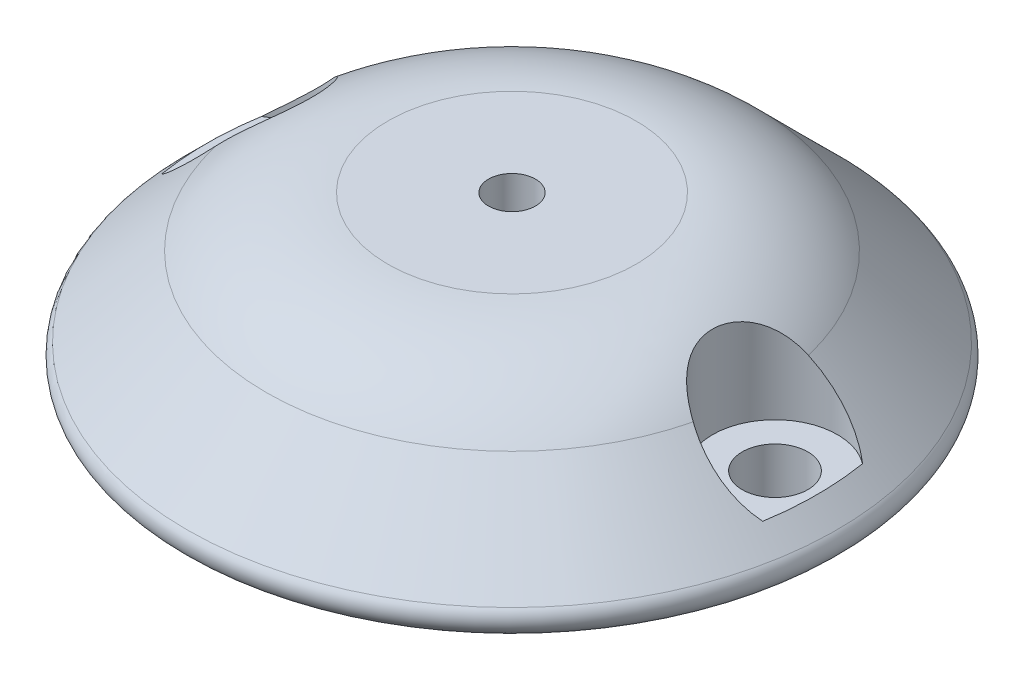
ISO-10303-21;
HEADER;
FILE_DESCRIPTION(('STEP AP214'),'2;1');
FILE_NAME('part.step','',(''),(''),'','','');
FILE_SCHEMA(('AUTOMOTIVE_DESIGN { 1 0 10303 214 1 1 1 1 }'));
ENDSEC;
DATA;
#1=APPLICATION_CONTEXT('core data for automotive mechanical design processes');
#2=APPLICATION_PROTOCOL_DEFINITION('international standard','automotive_design',2000,#1);
#3=PRODUCT_CONTEXT('',#1,'mechanical');
#4=PRODUCT('Part','Part','',(#3));
#5=PRODUCT_RELATED_PRODUCT_CATEGORY('part','',(#4));
#6=PRODUCT_DEFINITION_FORMATION('','',#4);
#7=PRODUCT_DEFINITION_CONTEXT('part definition',#1,'design');
#8=PRODUCT_DEFINITION('design','',#6,#7);
#9=PRODUCT_DEFINITION_SHAPE('','',#8);
#10=(LENGTH_UNIT() NAMED_UNIT(*) SI_UNIT(.MILLI.,.METRE.));
#11=(NAMED_UNIT(*) PLANE_ANGLE_UNIT() SI_UNIT($,.RADIAN.));
#12=(NAMED_UNIT(*) SI_UNIT($,.STERADIAN.) SOLID_ANGLE_UNIT());
#13=UNCERTAINTY_MEASURE_WITH_UNIT(LENGTH_MEASURE(1.E-05),#10,'distance_accuracy_value','');
#14=(GEOMETRIC_REPRESENTATION_CONTEXT(3) GLOBAL_UNCERTAINTY_ASSIGNED_CONTEXT((#13)) GLOBAL_UNIT_ASSIGNED_CONTEXT((#10,
#11,#12)) REPRESENTATION_CONTEXT('',''));
#15=CARTESIAN_POINT('',(0.,0.,0.));
#16=DIRECTION('',(0.,0.,1.));
#17=DIRECTION('',(1.,0.,0.));
#18=AXIS2_PLACEMENT_3D('',#15,#16,#17);
#19=CARTESIAN_POINT('',(0.,0.,0.));
#20=DIRECTION('',(0.,-1.,0.));
#21=DIRECTION('',(0.,0.,1.));
#22=AXIS2_PLACEMENT_3D('',#19,#20,#21);
#23=CONICAL_SURFACE('',#22,22.5,0.78539816339745);
#24=CARTESIAN_POINT('',(0.,6.77817459305204,0.));
#25=DIRECTION('',(0.,-1.,0.));
#26=DIRECTION('',(0.,0.,-1.));
#27=AXIS2_PLACEMENT_3D('',#24,#25,#26);
#28=CIRCLE('',#27,15.7218254069479);
#29=CARTESIAN_POINT('',(15.2829677399451,6.77817459305204,3.68872487268291));
#30=VERTEX_POINT('',#29);
#31=CARTESIAN_POINT('',(-15.2829677399452,6.77817459305204,3.68872487268292));
#32=VERTEX_POINT('',#31);
#33=EDGE_CURVE('E241',#30,#32,#28,.T.);
#34=ORIENTED_EDGE('',*,*,#33,.T.);
#35=CARTESIAN_POINT('',(-15.2827809101721,6.77837459305203,3.68864651167227));
#36=CARTESIAN_POINT('',(-15.3556214119869,6.70039792075547,3.71919565627907));
#37=CARTESIAN_POINT('',(-15.4291771882144,6.62223768590602,3.74751605339698));
#38=CARTESIAN_POINT('',(-15.5776040540579,6.46568132227529,3.79969735444955));
#39=CARTESIAN_POINT('',(-15.6524751115055,6.38728519930202,3.82355836728436));
#40=CARTESIAN_POINT('',(-15.878959549993,6.15186571266682,3.88847026467971));
#41=CARTESIAN_POINT('',(-16.0323805007537,5.99467943330654,3.92282337277419));
#42=CARTESIAN_POINT('',(-16.3443598610545,5.67955630530599,3.97358384555142));
#43=CARTESIAN_POINT('',(-16.5029531426249,5.52162642468076,3.98981835623395));
#44=CARTESIAN_POINT('',(-16.8226755978471,5.20760284012962,4.00319083112731));
#45=CARTESIAN_POINT('',(-16.9838038573479,5.05150850822159,4.00033552876619));
#46=CARTESIAN_POINT('',(-17.2753664604645,4.77275157035931,3.97725975147319));
#47=CARTESIAN_POINT('',(-17.4055839142719,4.64956965345093,3.96057686266032));
#48=CARTESIAN_POINT('',(-17.6659852752803,4.40571671747931,3.91390549758381));
#49=CARTESIAN_POINT('',(-17.7961691566899,4.28504655209695,3.88391257245397));
#50=CARTESIAN_POINT('',(-18.1839281874746,3.92911326056537,3.77342509493683));
#51=CARTESIAN_POINT('',(-18.4404140722418,3.69830320662007,3.67230383898596));
#52=CARTESIAN_POINT('',(-18.7832302471486,3.39498534938186,3.49228622050079));
#53=CARTESIAN_POINT('',(-18.8757395378771,3.31368016390115,3.43898486498313));
#54=CARTESIAN_POINT('',(-19.0582687378462,3.15423142854572,3.32362211758272));
#55=CARTESIAN_POINT('',(-19.1482847135834,3.0760927933348,3.26154773266341));
#56=CARTESIAN_POINT('',(-19.2366815222816,2.9998,3.19497794206911));
#57=B_SPLINE_CURVE_WITH_KNOTS('',3,(#35,#36,#37,#38,#39,#40,#41,#42,#43,#44,#45,#46,#47,#48,#49,
#50,#51,#52,#53,#54,#55,#56),.UNSPECIFIED.,.F.,.F.,(4,2,2,2,2,2,2,2,2,2,4),(0.,
0.332923737447555,0.665839343687091,1.33196078426048,2.00438419765175,2.67657044393553,
3.21612386085517,3.75585775895512,4.82832294364659,5.23065105942451,5.63358140008989),.UNSPECIFIED.);
#58=CARTESIAN_POINT('',(-19.236449792038,3.,3.19515248437382));
#59=VERTEX_POINT('',#58);
#60=EDGE_CURVE('E50',#32,#59,#57,.T.);
#61=ORIENTED_EDGE('',*,*,#60,.T.);
#62=CARTESIAN_POINT('',(0.,3.,0.));
#63=DIRECTION('',(0.,1.,0.));
#64=DIRECTION('',(0.,0.,1.));
#65=AXIS2_PLACEMENT_3D('',#62,#63,#64);
#66=CIRCLE('',#65,19.5);
#67=CARTESIAN_POINT('',(-19.236449792038,3.,-3.19515248437382));
#68=VERTEX_POINT('',#67);
#69=EDGE_CURVE('E11',#68,#59,#66,.T.);
#70=ORIENTED_EDGE('',*,*,#69,.F.);
#71=CARTESIAN_POINT('',(-19.2366815222816,2.9998,-3.19497794206911));
#72=CARTESIAN_POINT('',(-19.1244429595849,3.09666074565338,-3.27950092788761));
#73=CARTESIAN_POINT('',(-19.0095543267873,3.196547312217,-3.35680133139372));
#74=CARTESIAN_POINT('',(-18.7759968811746,3.40126905764813,-3.49738185689812));
#75=CARTESIAN_POINT('',(-18.6573335417717,3.50609716879653,-3.56068130758447));
#76=CARTESIAN_POINT('',(-18.4179246919157,3.71943017754951,-3.67368193603641));
#77=CARTESIAN_POINT('',(-18.2971898570869,3.82791802452729,-3.72343841781719));
#78=CARTESIAN_POINT('',(-18.0541668299962,4.04826573612872,-3.81025915963627));
#79=CARTESIAN_POINT('',(-17.9318779427408,4.1601271425323,-3.8473175177436));
#80=CARTESIAN_POINT('',(-17.6575494020541,4.41343509812977,-3.9165870188306));
#81=CARTESIAN_POINT('',(-17.505345613438,4.5555952662741,-3.94555360440932));
#82=CARTESIAN_POINT('',(-17.2014368007988,4.84293015571262,-3.98566613654094));
#83=CARTESIAN_POINT('',(-17.0497318774776,4.98810544699147,-3.99680868196262));
#84=CARTESIAN_POINT('',(-16.747782197924,5.28074070510491,-4.00200935221213));
#85=CARTESIAN_POINT('',(-16.5975402531299,5.42820403641085,-3.99603935222478));
#86=CARTESIAN_POINT('',(-16.2998618735929,5.72423310937551,-3.96753048107442));
#87=CARTESIAN_POINT('',(-16.1524243705452,5.87279840001984,-3.94499805423307));
#88=CARTESIAN_POINT('',(-15.8828775214537,6.14809583653357,-3.88831798647976));
#89=CARTESIAN_POINT('',(-15.7602593826737,6.27479266540987,-3.85639319579769));
#90=CARTESIAN_POINT('',(-15.5187421457102,6.5272759957753,-3.78107018755698));
#91=CARTESIAN_POINT('',(-15.399829817659,6.65306409776148,-3.73771973385811));
#92=CARTESIAN_POINT('',(-15.2827809101721,6.77837459305203,-3.68864651167227));
#93=B_SPLINE_CURVE_WITH_KNOTS('',3,(#71,#72,#73,#74,#75,#76,#77,#78,#79,#80,#81,#82,#83,#84,#85,
#86,#87,#88,#89,#90,#91,#92),.UNSPECIFIED.,.F.,.F.,(4,2,2,2,2,2,2,2,2,2,4),(0.,
0.511600261989383,1.02248977579381,1.53126060825215,2.04026759136353,2.67023220821521,
3.30031701873982,3.93143797988161,4.56231350627935,5.09946610559916,5.63440785886017),.UNSPECIFIED.);
#94=CARTESIAN_POINT('',(-15.2829677399451,6.77817459305204,-3.68872487268292));
#95=VERTEX_POINT('',#94);
#96=EDGE_CURVE('E194',#68,#95,#93,.T.);
#97=ORIENTED_EDGE('',*,*,#96,.T.);
#98=CARTESIAN_POINT('',(15.2829677399452,6.77817459305204,-3.68872487268292));
#99=VERTEX_POINT('',#98);
#100=EDGE_CURVE('E272',#95,#99,#28,.T.);
#101=ORIENTED_EDGE('',*,*,#100,.T.);
#102=CARTESIAN_POINT('',(15.2827809101721,6.77837459305203,-3.68864651167227));
#103=CARTESIAN_POINT('',(15.3556214119869,6.70039792075546,-3.71919565627907));
#104=CARTESIAN_POINT('',(15.4291771882144,6.62223768590601,-3.74751605339698));
#105=CARTESIAN_POINT('',(15.5776040540579,6.46568132227528,-3.79969735444956));
#106=CARTESIAN_POINT('',(15.6524751115055,6.38728519930201,-3.82355836728436));
#107=CARTESIAN_POINT('',(15.878959549993,6.15186571266682,-3.88847026467972));
#108=CARTESIAN_POINT('',(16.0323805007537,5.99467943330654,-3.9228233727742));
#109=CARTESIAN_POINT('',(16.3443598610545,5.67955630530599,-3.97358384555143));
#110=CARTESIAN_POINT('',(16.5029531426249,5.52162642468075,-3.98981835623396));
#111=CARTESIAN_POINT('',(16.8226755978471,5.20760284012961,-4.00319083112731));
#112=CARTESIAN_POINT('',(16.9838038573479,5.05150850822159,-4.00033552876619));
#113=CARTESIAN_POINT('',(17.2753664604645,4.7727515703593,-3.97725975147319));
#114=CARTESIAN_POINT('',(17.4055839142719,4.64956965345092,-3.96057686266032));
#115=CARTESIAN_POINT('',(17.6659852752803,4.4057167174793,-3.91390549758382));
#116=CARTESIAN_POINT('',(17.7961691566899,4.28504655209694,-3.88391257245397));
#117=CARTESIAN_POINT('',(18.1839281874746,3.92911326056536,-3.77342509493683));
#118=CARTESIAN_POINT('',(18.4404140722419,3.69830320662006,-3.67230383898596));
#119=CARTESIAN_POINT('',(18.7832302471486,3.39498534938186,-3.49228622050079));
#120=CARTESIAN_POINT('',(18.8757395378771,3.31368016390115,-3.43898486498313));
#121=CARTESIAN_POINT('',(19.0582687378463,3.15423142854572,-3.32362211758272));
#122=CARTESIAN_POINT('',(19.1482847135834,3.0760927933348,-3.26154773266341));
#123=CARTESIAN_POINT('',(19.2366815222816,2.9998,-3.19497794206912));
#124=B_SPLINE_CURVE_WITH_KNOTS('',3,(#102,#103,#104,#105,#106,#107,#108,#109,#110,#111,#112,
#113,#114,#115,#116,#117,#118,#119,#120,#121,#122,#123),.UNSPECIFIED.,.F.,.F.,(4,2,2,2,2,2,2,2,
2,2,4),(0.,0.332923737447557,0.665839343687096,1.33196078426049,2.00438419765176,
2.67657044393554,3.21612386085518,3.75585775895513,4.8283229436466,5.23065105942452,
5.63358140008988),.UNSPECIFIED.);
#125=CARTESIAN_POINT('',(19.236449792038,3.,-3.19515248437382));
#126=VERTEX_POINT('',#125);
#127=EDGE_CURVE('E58',#99,#126,#124,.T.);
#128=ORIENTED_EDGE('',*,*,#127,.T.);
#129=CARTESIAN_POINT('',(0.,3.,0.));
#130=DIRECTION('',(0.,1.,0.));
#131=DIRECTION('',(0.,0.,1.));
#132=AXIS2_PLACEMENT_3D('',#129,#130,#131);
#133=CIRCLE('',#132,19.5);
#134=CARTESIAN_POINT('',(19.236449792038,3.,3.19515248437381));
#135=VERTEX_POINT('',#134);
#136=EDGE_CURVE('E42',#135,#126,#133,.T.);
#137=ORIENTED_EDGE('',*,*,#136,.F.);
#138=CARTESIAN_POINT('',(19.2366815222816,2.9998,3.1949779420691));
#139=CARTESIAN_POINT('',(19.1244429595849,3.09666074565338,3.2795009278876));
#140=CARTESIAN_POINT('',(19.0095543267873,3.19654731221701,3.35680133139371));
#141=CARTESIAN_POINT('',(18.7759968811746,3.40126905764813,3.49738185689811));
#142=CARTESIAN_POINT('',(18.6573335417717,3.50609716879653,3.56068130758446));
#143=CARTESIAN_POINT('',(18.4179246919157,3.71943017754951,3.67368193603641));
#144=CARTESIAN_POINT('',(18.2971898570869,3.82791802452729,3.72343841781718));
#145=CARTESIAN_POINT('',(18.0541668299962,4.04826573612872,3.81025915963626));
#146=CARTESIAN_POINT('',(17.9318779427408,4.1601271425323,3.84731751774359));
#147=CARTESIAN_POINT('',(17.6575494020541,4.41343509812977,3.91658701883059));
#148=CARTESIAN_POINT('',(17.505345613438,4.5555952662741,3.94555360440931));
#149=CARTESIAN_POINT('',(17.2014368007988,4.84293015571263,3.98566613654093));
#150=CARTESIAN_POINT('',(17.0497318774776,4.98810544699147,3.99680868196261));
#151=CARTESIAN_POINT('',(16.747782197924,5.28074070510491,4.00200935221212));
#152=CARTESIAN_POINT('',(16.5975402531299,5.42820403641085,3.99603935222477));
#153=CARTESIAN_POINT('',(16.2998618735929,5.72423310937552,3.96753048107442));
#154=CARTESIAN_POINT('',(16.1524243705452,5.87279840001984,3.94499805423306));
#155=CARTESIAN_POINT('',(15.8828775214537,6.14809583653358,3.88831798647976));
#156=CARTESIAN_POINT('',(15.7602593826737,6.27479266540987,3.85639319579769));
#157=CARTESIAN_POINT('',(15.5187421457102,6.5272759957753,3.78107018755698));
#158=CARTESIAN_POINT('',(15.399829817659,6.65306409776148,3.7377197338581));
#159=CARTESIAN_POINT('',(15.2827809101721,6.77837459305203,3.68864651167226));
#160=B_SPLINE_CURVE_WITH_KNOTS('',3,(#138,#139,#140,#141,#142,#143,#144,#145,#146,#147,#148,
#149,#150,#151,#152,#153,#154,#155,#156,#157,#158,#159),.UNSPECIFIED.,.F.,.F.,(4,2,2,2,2,2,2,2,
2,2,4),(0.,0.511600261989383,1.02248977579381,1.53126060825215,2.04026759136353,2.6702322082152,
3.30031701873982,3.93143797988161,4.56231350627936,5.09946610559917,5.63440785886017),.UNSPECIFIED.);
#161=EDGE_CURVE('E123',#135,#30,#160,.T.);
#162=ORIENTED_EDGE('',*,*,#161,.T.);
#163=EDGE_LOOP('',(#34,#61,#70,#97,#101,#128,#137,#162));
#164=FACE_BOUND('',#163,.T.);
#165=CARTESIAN_POINT('',(0.,1.70710678118655,0.));
#166=DIRECTION('',(0.,1.,0.));
#167=DIRECTION('',(0.,0.,1.));
#168=AXIS2_PLACEMENT_3D('',#165,#166,#167);
#169=CIRCLE('',#168,20.7928932188135);
#170=CARTESIAN_POINT('',(0.,1.70710678118655,20.7928932188135));
#171=VERTEX_POINT('',#170);
#172=EDGE_CURVE('E263',#171,#171,#169,.T.);
#173=ORIENTED_EDGE('',*,*,#172,.T.);
#174=EDGE_LOOP('',(#173));
#175=FACE_BOUND('',#174,.T.);
#176=ADVANCED_FACE('F33',(#164,#175),#23,.T.);
#177=CARTESIAN_POINT('',(0.,10.,0.));
#178=DIRECTION('',(0.,1.,0.));
#179=DIRECTION('',(0.,0.,1.));
#180=AXIS2_PLACEMENT_3D('',#177,#178,#179);
#181=PLANE('',#180);
#182=CARTESIAN_POINT('',(0.,10.,0.));
#183=DIRECTION('',(0.,1.,0.));
#184=DIRECTION('',(0.,0.,1.));
#185=AXIS2_PLACEMENT_3D('',#182,#183,#184);
#186=CIRCLE('',#185,1.5);
#187=CARTESIAN_POINT('',(0.,10.,1.5));
#188=VERTEX_POINT('',#187);
#189=EDGE_CURVE('E226',#188,#188,#186,.T.);
#190=ORIENTED_EDGE('',*,*,#189,.F.);
#191=EDGE_LOOP('',(#190));
#192=FACE_BOUND('',#191,.T.);
#193=CARTESIAN_POINT('',(0.,10.,0.));
#194=DIRECTION('',(0.,1.,0.));
#195=DIRECTION('',(0.,0.,1.));
#196=AXIS2_PLACEMENT_3D('',#193,#194,#195);
#197=CIRCLE('',#196,7.94365081389593);
#198=CARTESIAN_POINT('',(0.,10.,7.94365081389593));
#199=VERTEX_POINT('',#198);
#200=EDGE_CURVE('E269',#199,#199,#197,.T.);
#201=ORIENTED_EDGE('',*,*,#200,.T.);
#202=EDGE_LOOP('',(#201));
#203=FACE_BOUND('',#202,.T.);
#204=ADVANCED_FACE('F170',(#192,#203),#181,.T.);
#205=CARTESIAN_POINT('',(0.,0.,0.));
#206=DIRECTION('',(0.,1.,0.));
#207=DIRECTION('',(0.,0.,1.));
#208=AXIS2_PLACEMENT_3D('',#205,#206,#207);
#209=PLANE('',#208);
#210=CARTESIAN_POINT('',(-16.83,0.,0.));
#211=DIRECTION('',(0.,1.,0.));
#212=DIRECTION('',(0.,0.,1.));
#213=AXIS2_PLACEMENT_3D('',#210,#211,#212);
#214=CIRCLE('',#213,2.1);
#215=CARTESIAN_POINT('',(-16.83,0.,2.1));
#216=VERTEX_POINT('',#215);
#217=EDGE_CURVE('E152',#216,#216,#214,.T.);
#218=ORIENTED_EDGE('',*,*,#217,.T.);
#219=EDGE_LOOP('',(#218));
#220=FACE_BOUND('',#219,.T.);
#221=CARTESIAN_POINT('',(16.83,0.,0.));
#222=DIRECTION('',(0.,1.,0.));
#223=DIRECTION('',(0.,0.,1.));
#224=AXIS2_PLACEMENT_3D('',#221,#222,#223);
#225=CIRCLE('',#224,2.1);
#226=CARTESIAN_POINT('',(16.83,0.,2.09999999999999));
#227=VERTEX_POINT('',#226);
#228=EDGE_CURVE('E230',#227,#227,#225,.T.);
#229=ORIENTED_EDGE('',*,*,#228,.T.);
#230=EDGE_LOOP('',(#229));
#231=FACE_BOUND('',#230,.T.);
#232=CARTESIAN_POINT('',(0.,0.,0.));
#233=DIRECTION('',(0.,1.,0.));
#234=DIRECTION('',(0.,0.,1.));
#235=AXIS2_PLACEMENT_3D('',#232,#233,#234);
#236=CIRCLE('',#235,20.0857864376269);
#237=CARTESIAN_POINT('',(0.,0.,20.0857864376269));
#238=VERTEX_POINT('',#237);
#239=EDGE_CURVE('E266',#238,#238,#236,.F.);
#240=ORIENTED_EDGE('',*,*,#239,.T.);
#241=EDGE_LOOP('',(#240));
#242=FACE_BOUND('',#241,.T.);
#243=DIRECTION('',(-1.,0.,0.));
#244=VECTOR('',#243,1.);
#245=CARTESIAN_POINT('',(-10.,0.,14.));
#246=LINE('',#245,#244);
#247=CARTESIAN_POINT('',(8.,0.,14.));
#248=VERTEX_POINT('',#247);
#249=CARTESIAN_POINT('',(-8.,0.,14.));
#250=VERTEX_POINT('',#249);
#251=EDGE_CURVE('E244',#248,#250,#246,.T.);
#252=ORIENTED_EDGE('',*,*,#251,.F.);
#253=CARTESIAN_POINT('',(8.,0.,12.));
#254=DIRECTION('',(0.,1.,0.));
#255=DIRECTION('',(0.,0.,1.));
#256=AXIS2_PLACEMENT_3D('',#253,#254,#255);
#257=CIRCLE('',#256,2.);
#258=CARTESIAN_POINT('',(10.,0.,12.));
#259=VERTEX_POINT('',#258);
#260=EDGE_CURVE('E305',#248,#259,#257,.T.);
#261=ORIENTED_EDGE('',*,*,#260,.T.);
#262=DIRECTION('',(0.,0.,1.));
#263=VECTOR('',#262,1.);
#264=CARTESIAN_POINT('',(10.,0.,-14.));
#265=LINE('',#264,#263);
#266=CARTESIAN_POINT('',(10.,0.,-12.));
#267=VERTEX_POINT('',#266);
#268=EDGE_CURVE('E242',#267,#259,#265,.T.);
#269=ORIENTED_EDGE('',*,*,#268,.F.);
#270=CARTESIAN_POINT('',(8.00000000000001,0.,-12.));
#271=DIRECTION('',(0.,1.,0.));
#272=DIRECTION('',(0.,0.,1.));
#273=AXIS2_PLACEMENT_3D('',#270,#271,#272);
#274=CIRCLE('',#273,2.);
#275=CARTESIAN_POINT('',(8.00000000000001,0.,-14.));
#276=VERTEX_POINT('',#275);
#277=EDGE_CURVE('E303',#267,#276,#274,.T.);
#278=ORIENTED_EDGE('',*,*,#277,.T.);
#279=DIRECTION('',(1.,0.,0.));
#280=VECTOR('',#279,1.);
#281=CARTESIAN_POINT('',(-9.99999999999999,0.,-14.));
#282=LINE('',#281,#280);
#283=CARTESIAN_POINT('',(-7.99999999999999,0.,-14.));
#284=VERTEX_POINT('',#283);
#285=EDGE_CURVE('E259',#284,#276,#282,.T.);
#286=ORIENTED_EDGE('',*,*,#285,.F.);
#287=CARTESIAN_POINT('',(-7.99999999999999,0.,-12.));
#288=DIRECTION('',(0.,1.,0.));
#289=DIRECTION('',(0.,0.,1.));
#290=AXIS2_PLACEMENT_3D('',#287,#288,#289);
#291=CIRCLE('',#290,2.);
#292=CARTESIAN_POINT('',(-9.99999999999999,0.,-12.));
#293=VERTEX_POINT('',#292);
#294=EDGE_CURVE('E307',#284,#293,#291,.T.);
#295=ORIENTED_EDGE('',*,*,#294,.T.);
#296=DIRECTION('',(0.,0.,-1.));
#297=VECTOR('',#296,1.);
#298=CARTESIAN_POINT('',(-9.99999999999999,0.,-14.));
#299=LINE('',#298,#297);
#300=CARTESIAN_POINT('',(-10.,0.,12.));
#301=VERTEX_POINT('',#300);
#302=EDGE_CURVE('E251',#301,#293,#299,.T.);
#303=ORIENTED_EDGE('',*,*,#302,.F.);
#304=CARTESIAN_POINT('',(-8.,0.,12.));
#305=DIRECTION('',(0.,1.,0.));
#306=DIRECTION('',(0.,0.,1.));
#307=AXIS2_PLACEMENT_3D('',#304,#305,#306);
#308=CIRCLE('',#307,2.);
#309=EDGE_CURVE('E301',#301,#250,#308,.T.);
#310=ORIENTED_EDGE('',*,*,#309,.T.);
#311=EDGE_LOOP('',(#252,#261,#269,#278,#286,#295,#303,#310));
#312=FACE_BOUND('',#311,.T.);
#313=ADVANCED_FACE('F175',(#220,#231,#242,#312),#209,.F.);
#314=CARTESIAN_POINT('',(0.,5.8,0.));
#315=DIRECTION('',(0.,1.,0.));
#316=DIRECTION('',(0.,0.,1.));
#317=AXIS2_PLACEMENT_3D('',#314,#315,#316);
#318=PLANE('',#317);
#319=CARTESIAN_POINT('',(0.,5.8,0.));
#320=DIRECTION('',(0.,1.,0.));
#321=DIRECTION('',(0.,0.,1.));
#322=AXIS2_PLACEMENT_3D('',#319,#320,#321);
#323=CIRCLE('',#322,1.5);
#324=CARTESIAN_POINT('',(0.,5.8,1.5));
#325=VERTEX_POINT('',#324);
#326=EDGE_CURVE('E37',#325,#325,#323,.T.);
#327=ORIENTED_EDGE('',*,*,#326,.T.);
#328=EDGE_LOOP('',(#327));
#329=FACE_BOUND('',#328,.T.);
#330=DIRECTION('',(-1.,0.,0.));
#331=VECTOR('',#330,1.);
#332=CARTESIAN_POINT('',(-10.,5.8,14.));
#333=LINE('',#332,#331);
#334=CARTESIAN_POINT('',(8.,5.8,14.));
#335=VERTEX_POINT('',#334);
#336=CARTESIAN_POINT('',(-8.,5.8,14.));
#337=VERTEX_POINT('',#336);
#338=EDGE_CURVE('E342',#335,#337,#333,.T.);
#339=ORIENTED_EDGE('',*,*,#338,.T.);
#340=CARTESIAN_POINT('',(-8.,5.8,12.));
#341=DIRECTION('',(0.,1.,0.));
#342=DIRECTION('',(0.,0.,1.));
#343=AXIS2_PLACEMENT_3D('',#340,#341,#342);
#344=CIRCLE('',#343,2.);
#345=CARTESIAN_POINT('',(-10.,5.8,12.));
#346=VERTEX_POINT('',#345);
#347=EDGE_CURVE('E290',#337,#346,#344,.F.);
#348=ORIENTED_EDGE('',*,*,#347,.T.);
#349=DIRECTION('',(0.,0.,-1.));
#350=VECTOR('',#349,1.);
#351=CARTESIAN_POINT('',(-9.99999999999999,5.8,-14.));
#352=LINE('',#351,#350);
#353=CARTESIAN_POINT('',(-9.99999999999999,5.8,-12.));
#354=VERTEX_POINT('',#353);
#355=EDGE_CURVE('E359',#346,#354,#352,.T.);
#356=ORIENTED_EDGE('',*,*,#355,.T.);
#357=CARTESIAN_POINT('',(-7.99999999999999,5.8,-12.));
#358=DIRECTION('',(0.,1.,0.));
#359=DIRECTION('',(0.,0.,1.));
#360=AXIS2_PLACEMENT_3D('',#357,#358,#359);
#361=CIRCLE('',#360,2.);
#362=CARTESIAN_POINT('',(-7.99999999999999,5.8,-14.));
#363=VERTEX_POINT('',#362);
#364=EDGE_CURVE('E284',#354,#363,#361,.F.);
#365=ORIENTED_EDGE('',*,*,#364,.T.);
#366=DIRECTION('',(1.,0.,0.));
#367=VECTOR('',#366,1.);
#368=CARTESIAN_POINT('',(-9.99999999999999,5.8,-14.));
#369=LINE('',#368,#367);
#370=CARTESIAN_POINT('',(8.00000000000001,5.8,-14.));
#371=VERTEX_POINT('',#370);
#372=EDGE_CURVE('E254',#363,#371,#369,.T.);
#373=ORIENTED_EDGE('',*,*,#372,.T.);
#374=CARTESIAN_POINT('',(8.00000000000001,5.8,-12.));
#375=DIRECTION('',(0.,1.,0.));
#376=DIRECTION('',(0.,0.,1.));
#377=AXIS2_PLACEMENT_3D('',#374,#375,#376);
#378=CIRCLE('',#377,2.);
#379=CARTESIAN_POINT('',(10.,5.8,-12.));
#380=VERTEX_POINT('',#379);
#381=EDGE_CURVE('E288',#371,#380,#378,.F.);
#382=ORIENTED_EDGE('',*,*,#381,.T.);
#383=DIRECTION('',(0.,0.,1.));
#384=VECTOR('',#383,1.);
#385=CARTESIAN_POINT('',(10.,5.8,-14.));
#386=LINE('',#385,#384);
#387=CARTESIAN_POINT('',(10.,5.8,12.));
#388=VERTEX_POINT('',#387);
#389=EDGE_CURVE('E262',#380,#388,#386,.T.);
#390=ORIENTED_EDGE('',*,*,#389,.T.);
#391=CARTESIAN_POINT('',(8.,5.8,12.));
#392=DIRECTION('',(0.,1.,0.));
#393=DIRECTION('',(0.,0.,1.));
#394=AXIS2_PLACEMENT_3D('',#391,#392,#393);
#395=CIRCLE('',#394,2.);
#396=EDGE_CURVE('E286',#388,#335,#395,.F.);
#397=ORIENTED_EDGE('',*,*,#396,.T.);
#398=EDGE_LOOP('',(#339,#348,#356,#365,#373,#382,#390,#397));
#399=FACE_BOUND('',#398,.T.);
#400=ADVANCED_FACE('F316',(#329,#399),#318,.F.);
#401=CARTESIAN_POINT('',(10.,5.8,-14.));
#402=DIRECTION('',(1.,0.,0.));
#403=DIRECTION('',(0.,0.,-1.));
#404=AXIS2_PLACEMENT_3D('',#401,#402,#403);
#405=PLANE('',#404);
#406=ORIENTED_EDGE('',*,*,#389,.F.);
#407=DIRECTION('',(0.,-1.,0.));
#408=VECTOR('',#407,1.);
#409=CARTESIAN_POINT('',(10.,0.,-12.));
#410=LINE('',#409,#408);
#411=EDGE_CURVE('E294',#380,#267,#410,.T.);
#412=ORIENTED_EDGE('',*,*,#411,.T.);
#413=ORIENTED_EDGE('',*,*,#268,.T.);
#414=DIRECTION('',(0.,-1.,0.));
#415=VECTOR('',#414,1.);
#416=CARTESIAN_POINT('',(10.,5.29534946591473,12.));
#417=LINE('',#416,#415);
#418=EDGE_CURVE('E292',#259,#388,#417,.F.);
#419=ORIENTED_EDGE('',*,*,#418,.T.);
#420=EDGE_LOOP('',(#406,#412,#413,#419));
#421=FACE_BOUND('',#420,.T.);
#422=ADVANCED_FACE('F321',(#421),#405,.F.);
#423=CARTESIAN_POINT('',(-9.99999999999999,5.8,-14.));
#424=DIRECTION('',(0.,0.,-1.));
#425=DIRECTION('',(-1.,0.,0.));
#426=AXIS2_PLACEMENT_3D('',#423,#424,#425);
#427=PLANE('',#426);
#428=ORIENTED_EDGE('',*,*,#285,.T.);
#429=DIRECTION('',(0.,-1.,0.));
#430=VECTOR('',#429,1.);
#431=CARTESIAN_POINT('',(8.00000000000001,5.29534946591473,-14.));
#432=LINE('',#431,#430);
#433=EDGE_CURVE('E299',#276,#371,#432,.F.);
#434=ORIENTED_EDGE('',*,*,#433,.T.);
#435=ORIENTED_EDGE('',*,*,#372,.F.);
#436=DIRECTION('',(0.,-1.,0.));
#437=VECTOR('',#436,1.);
#438=CARTESIAN_POINT('',(-7.99999999999999,0.,-14.));
#439=LINE('',#438,#437);
#440=EDGE_CURVE('E296',#363,#284,#439,.T.);
#441=ORIENTED_EDGE('',*,*,#440,.T.);
#442=EDGE_LOOP('',(#428,#434,#435,#441));
#443=FACE_BOUND('',#442,.T.);
#444=ADVANCED_FACE('F322',(#443),#427,.F.);
#445=CARTESIAN_POINT('',(-9.99999999999999,5.8,-14.));
#446=DIRECTION('',(-1.,0.,0.));
#447=DIRECTION('',(0.,0.,1.));
#448=AXIS2_PLACEMENT_3D('',#445,#446,#447);
#449=PLANE('',#448);
#450=ORIENTED_EDGE('',*,*,#355,.F.);
#451=DIRECTION('',(0.,-1.,0.));
#452=VECTOR('',#451,1.);
#453=CARTESIAN_POINT('',(-10.,0.,12.));
#454=LINE('',#453,#452);
#455=EDGE_CURVE('E276',#346,#301,#454,.T.);
#456=ORIENTED_EDGE('',*,*,#455,.T.);
#457=ORIENTED_EDGE('',*,*,#302,.T.);
#458=DIRECTION('',(0.,-1.,0.));
#459=VECTOR('',#458,1.);
#460=CARTESIAN_POINT('',(-9.99999999999999,5.29534946591473,-12.));
#461=LINE('',#460,#459);
#462=EDGE_CURVE('E274',#293,#354,#461,.F.);
#463=ORIENTED_EDGE('',*,*,#462,.T.);
#464=EDGE_LOOP('',(#450,#456,#457,#463));
#465=FACE_BOUND('',#464,.T.);
#466=ADVANCED_FACE('F325',(#465),#449,.F.);
#467=CARTESIAN_POINT('',(-10.,5.8,14.));
#468=DIRECTION('',(0.,0.,1.));
#469=DIRECTION('',(1.,0.,0.));
#470=AXIS2_PLACEMENT_3D('',#467,#468,#469);
#471=PLANE('',#470);
#472=ORIENTED_EDGE('',*,*,#251,.T.);
#473=DIRECTION('',(0.,-1.,0.));
#474=VECTOR('',#473,1.);
#475=CARTESIAN_POINT('',(-8.,5.29534946591473,14.));
#476=LINE('',#475,#474);
#477=EDGE_CURVE('E282',#250,#337,#476,.F.);
#478=ORIENTED_EDGE('',*,*,#477,.T.);
#479=ORIENTED_EDGE('',*,*,#338,.F.);
#480=DIRECTION('',(0.,-1.,0.));
#481=VECTOR('',#480,1.);
#482=CARTESIAN_POINT('',(8.,0.,14.));
#483=LINE('',#482,#481);
#484=EDGE_CURVE('E279',#335,#248,#483,.T.);
#485=ORIENTED_EDGE('',*,*,#484,.T.);
#486=EDGE_LOOP('',(#472,#478,#479,#485));
#487=FACE_BOUND('',#486,.T.);
#488=ADVANCED_FACE('F329',(#487),#471,.F.);
#489=CARTESIAN_POINT('',(0.,1.,0.));
#490=DIRECTION('',(0.,1.,0.));
#491=DIRECTION('',(0.,0.,1.));
#492=AXIS2_PLACEMENT_3D('',#489,#490,#491);
#493=TOROIDAL_SURFACE('',#492,20.0857864376269,1.);
#494=ORIENTED_EDGE('',*,*,#239,.F.);
#495=EDGE_LOOP('',(#494));
#496=FACE_BOUND('',#495,.T.);
#497=ORIENTED_EDGE('',*,*,#172,.F.);
#498=EDGE_LOOP('',(#497));
#499=FACE_BOUND('',#498,.T.);
#500=ADVANCED_FACE('F181',(#496,#499),#493,.T.);
#501=CARTESIAN_POINT('',(0.,-0.999999999999997,0.));
#502=DIRECTION('',(0.,1.,0.));
#503=DIRECTION('',(0.,0.,1.));
#504=AXIS2_PLACEMENT_3D('',#501,#502,#503);
#505=DEGENERATE_TOROIDAL_SURFACE('',#504,7.94365081389593,11.,.T.);
#506=CARTESIAN_POINT('',(-15.283154567291,6.77797459305204,3.68880322154862));
#507=CARTESIAN_POINT('',(-15.1916388147093,6.87596686921446,3.65042309964722));
#508=CARTESIAN_POINT('',(-15.0995000319904,6.97179517170423,3.60778306841231));
#509=CARTESIAN_POINT('',(-14.9148089856312,7.15869590521139,3.51323773932636));
#510=CARTESIAN_POINT('',(-14.8222562850131,7.24975995693166,3.46131678257641));
#511=CARTESIAN_POINT('',(-14.6372525538536,7.42697558958405,3.34719805720307));
#512=CARTESIAN_POINT('',(-14.5448066296315,7.51308894623902,3.28493186189526));
#513=CARTESIAN_POINT('',(-14.3620512898898,7.67894778504341,3.14994500835223));
#514=CARTESIAN_POINT('',(-14.271740404873,7.75869774241401,3.07723179985272));
#515=CARTESIAN_POINT('',(-14.0439768474604,7.95480913882559,2.87617884798981));
#516=CARTESIAN_POINT('',(-13.9090196220924,8.06610475947076,2.7397683581481));
#517=CARTESIAN_POINT('',(-13.718426548748,8.21781379345679,2.51550305781718));
#518=CARTESIAN_POINT('',(-13.6569206475522,8.26580710899618,2.43755401917711));
#519=CARTESIAN_POINT('',(-13.5386337299187,8.35654104882459,2.27529467485413));
#520=CARTESIAN_POINT('',(-13.4818504356732,8.39928421016793,2.19098747369596));
#521=CARTESIAN_POINT('',(-13.3734661732994,8.47958869867628,2.01570774281569));
#522=CARTESIAN_POINT('',(-13.321908986707,8.51710709889961,1.92468843684088));
#523=CARTESIAN_POINT('',(-13.2253730128735,8.58636288191456,1.73717483909523));
#524=CARTESIAN_POINT('',(-13.1803912704693,8.61810286325072,1.64068303402853));
#525=CARTESIAN_POINT('',(-13.0977429406759,8.67571205441289,1.44283078675444));
#526=CARTESIAN_POINT('',(-13.0600821004161,8.70157665455049,1.34146659680951));
#527=CARTESIAN_POINT('',(-12.9928082685672,8.74732552860532,1.13479733550207));
#528=CARTESIAN_POINT('',(-12.9631943976591,8.76721045596658,1.02949269615739));
#529=CARTESIAN_POINT('',(-12.915289872003,8.79914719745187,0.827427348766008));
#530=CARTESIAN_POINT('',(-12.8961224687245,8.81181251674092,0.73097003302807));
#531=CARTESIAN_POINT('',(-12.8648999435531,8.8323578820227,0.536370911022936));
#532=CARTESIAN_POINT('',(-12.8528471538074,8.84023635892884,0.438228563244328));
#533=CARTESIAN_POINT('',(-12.8360514499433,8.8511969399145,0.24114065641311));
#534=CARTESIAN_POINT('',(-12.8313022452776,8.85428317155705,0.142195862437949));
#535=CARTESIAN_POINT('',(-12.8291638036051,8.85567414058439,-0.0558444547006774));
#536=CARTESIAN_POINT('',(-12.8317772393747,8.85397714156672,-0.154940019546149));
#537=CARTESIAN_POINT('',(-12.8440462166785,8.84598229713219,-0.347996165377534));
#538=CARTESIAN_POINT('',(-12.8533779999956,8.83989595257392,-0.441986330639322));
#539=CARTESIAN_POINT('',(-12.8785976313968,8.82335608265516,-0.628728202539675));
#540=CARTESIAN_POINT('',(-12.8944877735096,8.81290102916124,-0.721479464094592));
#541=CARTESIAN_POINT('',(-12.9326027764892,8.78763033799364,-0.905028927930863));
#542=CARTESIAN_POINT('',(-12.9548253214613,8.77281629443116,-0.995827831199019));
#543=CARTESIAN_POINT('',(-13.0053163537172,8.73883376557119,-1.17492820760143));
#544=CARTESIAN_POINT('',(-13.0335870787924,8.71966366839576,-1.26322874262497));
#545=CARTESIAN_POINT('',(-13.0960049272724,8.67685697510572,-1.43731856690729));
#546=CARTESIAN_POINT('',(-13.1301901573086,8.6531913110571,-1.52308706443099));
#547=CARTESIAN_POINT('',(-13.2038475152288,8.60153897504348,-1.69098760609868));
#548=CARTESIAN_POINT('',(-13.2433215444791,8.57355074852695,-1.77311832823743));
#549=CARTESIAN_POINT('',(-13.3688622544729,8.48326350438675,-2.01321689534262));
#550=CARTESIAN_POINT('',(-13.4621382193126,8.41458122594634,-2.165139114978));
#551=CARTESIAN_POINT('',(-13.669140369825,8.25691343898216,-2.45826967966108));
#552=CARTESIAN_POINT('',(-13.7837429136403,8.1669762245405,-2.5983336329691));
#553=CARTESIAN_POINT('',(-14.0241986738578,7.97092003113625,-2.85633524083679));
#554=CARTESIAN_POINT('',(-14.150078812349,7.86476187918782,-2.97421774738611));
#555=CARTESIAN_POINT('',(-14.3605824289483,7.68009832363201,-3.14852980146761));
#556=CARTESIAN_POINT('',(-14.4434205128607,7.60571508882338,-3.21164885891714));
#557=CARTESIAN_POINT('',(-14.610546990034,7.45185504563366,-3.32933460156351));
#558=CARTESIAN_POINT('',(-14.6948361322574,7.37237554541939,-3.38389671369796));
#559=CARTESIAN_POINT('',(-14.8634124866589,7.20932283780218,-3.48455549931275));
#560=CARTESIAN_POINT('',(-14.9476972197862,7.12577422585868,-3.53069656818586));
#561=CARTESIAN_POINT('',(-15.1158754801222,6.95473815712171,-3.61533105102244));
#562=CARTESIAN_POINT('',(-15.1997693684522,6.86725584287601,-3.65383411299003));
#563=CARTESIAN_POINT('',(-15.283154567291,6.77797459305204,-3.68880322154862));
#564=B_SPLINE_CURVE_WITH_KNOTS('',3,(#506,#507,#508,#509,#510,#511,#512,#513,#514,#515,#516,
#517,#518,#519,#520,#521,#522,#523,#524,#525,#526,#527,#528,#529,#530,#531,#532,#533,#534,#535,
#536,#537,#538,#539,#540,#541,#542,#543,#544,#545,#546,#547,#548,#549,#550,#551,#552,#553,#554,
#555,#556,#557,#558,#559,#560,#561,#562,#563),.UNSPECIFIED.,.F.,.F.,(4,2,2,2,2,2,2,2,2,2,2,2,2,
2,2,2,2,2,2,2,2,2,2,2,2,2,2,2,4),(0.,0.418402077555917,0.837516868865441,1.25952305419335,
1.68122978810333,2.34349252897621,2.67401426304347,3.00437564402244,3.33730865450364,
3.67009157377865,4.00313469193582,4.33614140271845,4.63323353980504,4.93042300872566,
5.22735636595835,5.52439752945107,5.80800771118756,6.09171718026273,6.37532302360823,
6.65903398149567,6.94464600072915,7.23036097670939,7.80098758188178,8.40495004076645,
9.01039479803519,9.39397423908874,9.77775798186912,10.1594559840204,10.5406687277331),.UNSPECIFIED.);
#565=EDGE_CURVE('E140',#32,#95,#564,.T.);
#566=ORIENTED_EDGE('',*,*,#565,.F.);
#567=ORIENTED_EDGE('',*,*,#33,.F.);
#568=CARTESIAN_POINT('',(15.283154567291,6.77797459305204,-3.68880322154862));
#569=CARTESIAN_POINT('',(15.1916388147093,6.87596686921446,-3.65042309964723));
#570=CARTESIAN_POINT('',(15.0995000319904,6.97179517170423,-3.60778306841231));
#571=CARTESIAN_POINT('',(14.9148089856312,7.15869590521139,-3.51323773932636));
#572=CARTESIAN_POINT('',(14.8222562850131,7.24975995693166,-3.46131678257641));
#573=CARTESIAN_POINT('',(14.6372525538536,7.42697558958405,-3.34719805720308));
#574=CARTESIAN_POINT('',(14.5448066296315,7.51308894623902,-3.28493186189527));
#575=CARTESIAN_POINT('',(14.3620512898898,7.67894778504341,-3.14994500835223));
#576=CARTESIAN_POINT('',(14.271740404873,7.75869774241401,-3.07723179985273));
#577=CARTESIAN_POINT('',(14.0439768474604,7.95480913882558,-2.87617884798982));
#578=CARTESIAN_POINT('',(13.9090196220924,8.06610475947075,-2.73976835814811));
#579=CARTESIAN_POINT('',(13.718426548748,8.21781379345678,-2.51550305781719));
#580=CARTESIAN_POINT('',(13.6569206475522,8.26580710899618,-2.43755401917712));
#581=CARTESIAN_POINT('',(13.5386337299187,8.35654104882459,-2.27529467485414));
#582=CARTESIAN_POINT('',(13.4818504356732,8.39928421016793,-2.19098747369597));
#583=CARTESIAN_POINT('',(13.3734661732994,8.47958869867627,-2.0157077428157));
#584=CARTESIAN_POINT('',(13.321908986707,8.51710709889961,-1.92468843684089));
#585=CARTESIAN_POINT('',(13.2253730128735,8.58636288191456,-1.73717483909524));
#586=CARTESIAN_POINT('',(13.1803912704693,8.61810286325072,-1.64068303402854));
#587=CARTESIAN_POINT('',(13.0977429406759,8.67571205441289,-1.44283078675445));
#588=CARTESIAN_POINT('',(13.0600821004161,8.70157665455049,-1.34146659680952));
#589=CARTESIAN_POINT('',(12.9928082685672,8.74732552860532,-1.13479733550208));
#590=CARTESIAN_POINT('',(12.9631943976591,8.76721045596658,-1.0294926961574));
#591=CARTESIAN_POINT('',(12.915289872003,8.79914719745187,-0.827427348766021));
#592=CARTESIAN_POINT('',(12.8961224687245,8.81181251674092,-0.730970033028083));
#593=CARTESIAN_POINT('',(12.8648999435531,8.8323578820227,-0.536370911022949));
#594=CARTESIAN_POINT('',(12.8528471538074,8.84023635892884,-0.438228563244341));
#595=CARTESIAN_POINT('',(12.8360514499433,8.85119693991449,-0.241140656413123));
#596=CARTESIAN_POINT('',(12.8313022452776,8.85428317155705,-0.142195862437962));
#597=CARTESIAN_POINT('',(12.8291638036051,8.85567414058439,0.0558444547006647));
#598=CARTESIAN_POINT('',(12.8317772393747,8.85397714156672,0.154940019546137));
#599=CARTESIAN_POINT('',(12.8440462166785,8.84598229713219,0.347996165377522));
#600=CARTESIAN_POINT('',(12.8533779999956,8.83989595257391,0.441986330639309));
#601=CARTESIAN_POINT('',(12.8785976313968,8.82335608265516,0.628728202539663));
#602=CARTESIAN_POINT('',(12.8944877735096,8.81290102916124,0.72147946409458));
#603=CARTESIAN_POINT('',(12.9326027764892,8.78763033799364,0.90502892793085));
#604=CARTESIAN_POINT('',(12.9548253214613,8.77281629443116,0.995827831199007));
#605=CARTESIAN_POINT('',(13.0053163537172,8.73883376557119,1.17492820760142));
#606=CARTESIAN_POINT('',(13.0335870787924,8.71966366839575,1.26322874262495));
#607=CARTESIAN_POINT('',(13.0960049272724,8.67685697510572,1.43731856690728));
#608=CARTESIAN_POINT('',(13.1301901573086,8.6531913110571,1.52308706443097));
#609=CARTESIAN_POINT('',(13.2038475152288,8.60153897504348,1.69098760609867));
#610=CARTESIAN_POINT('',(13.2433215444791,8.57355074852695,1.77311832823742));
#611=CARTESIAN_POINT('',(13.3688622544729,8.48326350438676,2.01321689534261));
#612=CARTESIAN_POINT('',(13.4621382193126,8.41458122594634,2.16513911497799));
#613=CARTESIAN_POINT('',(13.669140369825,8.25691343898216,2.45826967966107));
#614=CARTESIAN_POINT('',(13.7837429136403,8.1669762245405,2.59833363296909));
#615=CARTESIAN_POINT('',(14.0241986738578,7.97092003113625,2.85633524083678));
#616=CARTESIAN_POINT('',(14.150078812349,7.86476187918783,2.9742177473861));
#617=CARTESIAN_POINT('',(14.3605824289483,7.68009832363201,3.1485298014676));
#618=CARTESIAN_POINT('',(14.4434205128607,7.60571508882338,3.21164885891713));
#619=CARTESIAN_POINT('',(14.610546990034,7.45185504563366,3.32933460156351));
#620=CARTESIAN_POINT('',(14.6948361322574,7.3723755454194,3.38389671369795));
#621=CARTESIAN_POINT('',(14.8634124866589,7.20932283780219,3.48455549931274));
#622=CARTESIAN_POINT('',(14.9476972197862,7.12577422585868,3.53069656818585));
#623=CARTESIAN_POINT('',(15.1158754801222,6.95473815712172,3.61533105102243));
#624=CARTESIAN_POINT('',(15.1997693684522,6.86725584287601,3.65383411299002));
#625=CARTESIAN_POINT('',(15.283154567291,6.77797459305204,3.68880322154861));
#626=B_SPLINE_CURVE_WITH_KNOTS('',3,(#568,#569,#570,#571,#572,#573,#574,#575,#576,#577,#578,
#579,#580,#581,#582,#583,#584,#585,#586,#587,#588,#589,#590,#591,#592,#593,#594,#595,#596,#597,
#598,#599,#600,#601,#602,#603,#604,#605,#606,#607,#608,#609,#610,#611,#612,#613,#614,#615,#616,
#617,#618,#619,#620,#621,#622,#623,#624,#625),.UNSPECIFIED.,.F.,.F.,(4,2,2,2,2,2,2,2,2,2,2,2,2,
2,2,2,2,2,2,2,2,2,2,2,2,2,2,2,4),(0.,0.418402077555917,0.837516868865439,1.25952305419335,
1.68122978810333,2.3434925289762,2.67401426304346,3.00437564402243,3.33730865450363,
3.67009157377864,4.00313469193582,4.33614140271844,4.63323353980503,4.93042300872565,
5.22735636595834,5.52439752945106,5.80800771118755,6.09171718026272,6.37532302360822,
6.65903398149566,6.94464600072913,7.23036097670938,7.80098758188177,8.40495004076644,
9.01039479803518,9.39397423908874,9.77775798186912,10.1594559840203,10.5406687277331),.UNSPECIFIED.);
#627=EDGE_CURVE('E127',#99,#30,#626,.T.);
#628=ORIENTED_EDGE('',*,*,#627,.F.);
#629=ORIENTED_EDGE('',*,*,#100,.F.);
#630=EDGE_LOOP('',(#566,#567,#628,#629));
#631=FACE_BOUND('',#630,.T.);
#632=ORIENTED_EDGE('',*,*,#200,.F.);
#633=EDGE_LOOP('',(#632));
#634=FACE_BOUND('',#633,.T.);
#635=ADVANCED_FACE('F311',(#631,#634),#505,.T.);
#636=CARTESIAN_POINT('',(-8.,5.8,12.));
#637=DIRECTION('',(0.,1.,0.));
#638=DIRECTION('',(0.,0.,1.));
#639=AXIS2_PLACEMENT_3D('',#636,#637,#638);
#640=CYLINDRICAL_SURFACE('',#639,2.);
#641=ORIENTED_EDGE('',*,*,#347,.F.);
#642=ORIENTED_EDGE('',*,*,#477,.F.);
#643=ORIENTED_EDGE('',*,*,#309,.F.);
#644=ORIENTED_EDGE('',*,*,#455,.F.);
#645=EDGE_LOOP('',(#641,#642,#643,#644));
#646=FACE_BOUND('',#645,.T.);
#647=ADVANCED_FACE('F362',(#646),#640,.F.);
#648=CARTESIAN_POINT('',(8.00000000000001,5.8,-12.));
#649=DIRECTION('',(0.,1.,0.));
#650=DIRECTION('',(0.,0.,1.));
#651=AXIS2_PLACEMENT_3D('',#648,#649,#650);
#652=CYLINDRICAL_SURFACE('',#651,2.);
#653=ORIENTED_EDGE('',*,*,#381,.F.);
#654=ORIENTED_EDGE('',*,*,#433,.F.);
#655=ORIENTED_EDGE('',*,*,#277,.F.);
#656=ORIENTED_EDGE('',*,*,#411,.F.);
#657=EDGE_LOOP('',(#653,#654,#655,#656));
#658=FACE_BOUND('',#657,.T.);
#659=ADVANCED_FACE('F345',(#658),#652,.F.);
#660=CARTESIAN_POINT('',(8.,5.8,12.));
#661=DIRECTION('',(0.,1.,0.));
#662=DIRECTION('',(0.,0.,1.));
#663=AXIS2_PLACEMENT_3D('',#660,#661,#662);
#664=CYLINDRICAL_SURFACE('',#663,2.);
#665=ORIENTED_EDGE('',*,*,#396,.F.);
#666=ORIENTED_EDGE('',*,*,#418,.F.);
#667=ORIENTED_EDGE('',*,*,#260,.F.);
#668=ORIENTED_EDGE('',*,*,#484,.F.);
#669=EDGE_LOOP('',(#665,#666,#667,#668));
#670=FACE_BOUND('',#669,.T.);
#671=ADVANCED_FACE('F167',(#670),#664,.F.);
#672=CARTESIAN_POINT('',(-7.99999999999999,5.8,-12.));
#673=DIRECTION('',(0.,1.,0.));
#674=DIRECTION('',(0.,0.,1.));
#675=AXIS2_PLACEMENT_3D('',#672,#673,#674);
#676=CYLINDRICAL_SURFACE('',#675,2.);
#677=ORIENTED_EDGE('',*,*,#364,.F.);
#678=ORIENTED_EDGE('',*,*,#462,.F.);
#679=ORIENTED_EDGE('',*,*,#294,.F.);
#680=ORIENTED_EDGE('',*,*,#440,.F.);
#681=EDGE_LOOP('',(#677,#678,#679,#680));
#682=FACE_BOUND('',#681,.T.);
#683=ADVANCED_FACE('F35',(#682),#676,.F.);
#684=CARTESIAN_POINT('',(16.83,3.,0.));
#685=DIRECTION('',(0.,1.,0.));
#686=DIRECTION('',(0.,0.,1.));
#687=AXIS2_PLACEMENT_3D('',#684,#685,#686);
#688=PLANE('',#687);
#689=CARTESIAN_POINT('',(16.83,3.,0.));
#690=DIRECTION('',(0.,1.,0.));
#691=DIRECTION('',(0.,0.,1.));
#692=AXIS2_PLACEMENT_3D('',#689,#690,#691);
#693=CIRCLE('',#692,2.1);
#694=CARTESIAN_POINT('',(16.83,3.,2.09999999999999));
#695=VERTEX_POINT('',#694);
#696=EDGE_CURVE('E136',#695,#695,#693,.T.);
#697=ORIENTED_EDGE('',*,*,#696,.F.);
#698=EDGE_LOOP('',(#697));
#699=FACE_BOUND('',#698,.T.);
#700=ORIENTED_EDGE('',*,*,#136,.T.);
#701=CARTESIAN_POINT('',(16.83,3.,0.));
#702=DIRECTION('',(0.,1.,0.));
#703=DIRECTION('',(0.,0.,1.));
#704=AXIS2_PLACEMENT_3D('',#701,#702,#703);
#705=CIRCLE('',#704,4.);
#706=EDGE_CURVE('E126',#126,#135,#705,.T.);
#707=ORIENTED_EDGE('',*,*,#706,.T.);
#708=EDGE_LOOP('',(#700,#707));
#709=FACE_BOUND('',#708,.T.);
#710=ADVANCED_FACE('F135',(#699,#709),#688,.T.);
#711=CARTESIAN_POINT('',(16.83,3.,0.));
#712=DIRECTION('',(0.,1.,0.));
#713=DIRECTION('',(0.,0.,1.));
#714=AXIS2_PLACEMENT_3D('',#711,#712,#713);
#715=CYLINDRICAL_SURFACE('',#714,4.);
#716=ORIENTED_EDGE('',*,*,#627,.T.);
#717=ORIENTED_EDGE('',*,*,#161,.F.);
#718=ORIENTED_EDGE('',*,*,#706,.F.);
#719=ORIENTED_EDGE('',*,*,#127,.F.);
#720=EDGE_LOOP('',(#716,#717,#718,#719));
#721=FACE_BOUND('',#720,.T.);
#722=ADVANCED_FACE('F125',(#721),#715,.F.);
#723=CARTESIAN_POINT('',(-16.83,3.,0.));
#724=DIRECTION('',(0.,1.,0.));
#725=DIRECTION('',(0.,0.,1.));
#726=AXIS2_PLACEMENT_3D('',#723,#724,#725);
#727=PLANE('',#726);
#728=CARTESIAN_POINT('',(-16.83,3.,0.));
#729=DIRECTION('',(0.,1.,0.));
#730=DIRECTION('',(0.,0.,1.));
#731=AXIS2_PLACEMENT_3D('',#728,#729,#730);
#732=CIRCLE('',#731,2.1);
#733=CARTESIAN_POINT('',(-16.83,3.,2.1));
#734=VERTEX_POINT('',#733);
#735=EDGE_CURVE('E150',#734,#734,#732,.T.);
#736=ORIENTED_EDGE('',*,*,#735,.F.);
#737=EDGE_LOOP('',(#736));
#738=FACE_BOUND('',#737,.T.);
#739=ORIENTED_EDGE('',*,*,#69,.T.);
#740=CARTESIAN_POINT('',(-16.83,3.,0.));
#741=DIRECTION('',(0.,1.,0.));
#742=DIRECTION('',(0.,0.,1.));
#743=AXIS2_PLACEMENT_3D('',#740,#741,#742);
#744=CIRCLE('',#743,4.);
#745=EDGE_CURVE('E132',#59,#68,#744,.T.);
#746=ORIENTED_EDGE('',*,*,#745,.T.);
#747=EDGE_LOOP('',(#739,#746));
#748=FACE_BOUND('',#747,.T.);
#749=ADVANCED_FACE('F165',(#738,#748),#727,.T.);
#750=CARTESIAN_POINT('',(-16.83,3.,0.));
#751=DIRECTION('',(0.,1.,0.));
#752=DIRECTION('',(0.,0.,1.));
#753=AXIS2_PLACEMENT_3D('',#750,#751,#752);
#754=CYLINDRICAL_SURFACE('',#753,4.);
#755=ORIENTED_EDGE('',*,*,#565,.T.);
#756=ORIENTED_EDGE('',*,*,#96,.F.);
#757=ORIENTED_EDGE('',*,*,#745,.F.);
#758=ORIENTED_EDGE('',*,*,#60,.F.);
#759=EDGE_LOOP('',(#755,#756,#757,#758));
#760=FACE_BOUND('',#759,.T.);
#761=ADVANCED_FACE('F203',(#760),#754,.F.);
#762=CARTESIAN_POINT('',(-16.83,0.,0.));
#763=DIRECTION('',(0.,1.,0.));
#764=DIRECTION('',(0.,0.,1.));
#765=AXIS2_PLACEMENT_3D('',#762,#763,#764);
#766=CYLINDRICAL_SURFACE('',#765,2.1);
#767=ORIENTED_EDGE('',*,*,#735,.T.);
#768=EDGE_LOOP('',(#767));
#769=FACE_BOUND('',#768,.T.);
#770=ORIENTED_EDGE('',*,*,#217,.F.);
#771=EDGE_LOOP('',(#770));
#772=FACE_BOUND('',#771,.T.);
#773=ADVANCED_FACE('F207',(#769,#772),#766,.F.);
#774=CARTESIAN_POINT('',(16.83,0.,0.));
#775=DIRECTION('',(0.,1.,0.));
#776=DIRECTION('',(0.,0.,1.));
#777=AXIS2_PLACEMENT_3D('',#774,#775,#776);
#778=CYLINDRICAL_SURFACE('',#777,2.1);
#779=ORIENTED_EDGE('',*,*,#696,.T.);
#780=EDGE_LOOP('',(#779));
#781=FACE_BOUND('',#780,.T.);
#782=ORIENTED_EDGE('',*,*,#228,.F.);
#783=EDGE_LOOP('',(#782));
#784=FACE_BOUND('',#783,.T.);
#785=ADVANCED_FACE('F156',(#781,#784),#778,.F.);
#786=CARTESIAN_POINT('',(0.,0.,0.));
#787=DIRECTION('',(0.,1.,0.));
#788=DIRECTION('',(0.,0.,1.));
#789=AXIS2_PLACEMENT_3D('',#786,#787,#788);
#790=CYLINDRICAL_SURFACE('',#789,1.5);
#791=ORIENTED_EDGE('',*,*,#189,.T.);
#792=EDGE_LOOP('',(#791));
#793=FACE_BOUND('',#792,.T.);
#794=ORIENTED_EDGE('',*,*,#326,.F.);
#795=EDGE_LOOP('',(#794));
#796=FACE_BOUND('',#795,.T.);
#797=ADVANCED_FACE('F215',(#793,#796),#790,.F.);
#798=CLOSED_SHELL('',(#176,#204,#313,#400,#422,#444,#466,#488,#500,#635,#647,#659,#671,#683,
#710,#722,#749,#761,#773,#785,#797));
#799=MANIFOLD_SOLID_BREP('B2',#798);
#800=ADVANCED_BREP_SHAPE_REPRESENTATION('',(#18,#799),#14);
#801=SHAPE_DEFINITION_REPRESENTATION(#9,#800);
ENDSEC;
END-ISO-10303-21;
